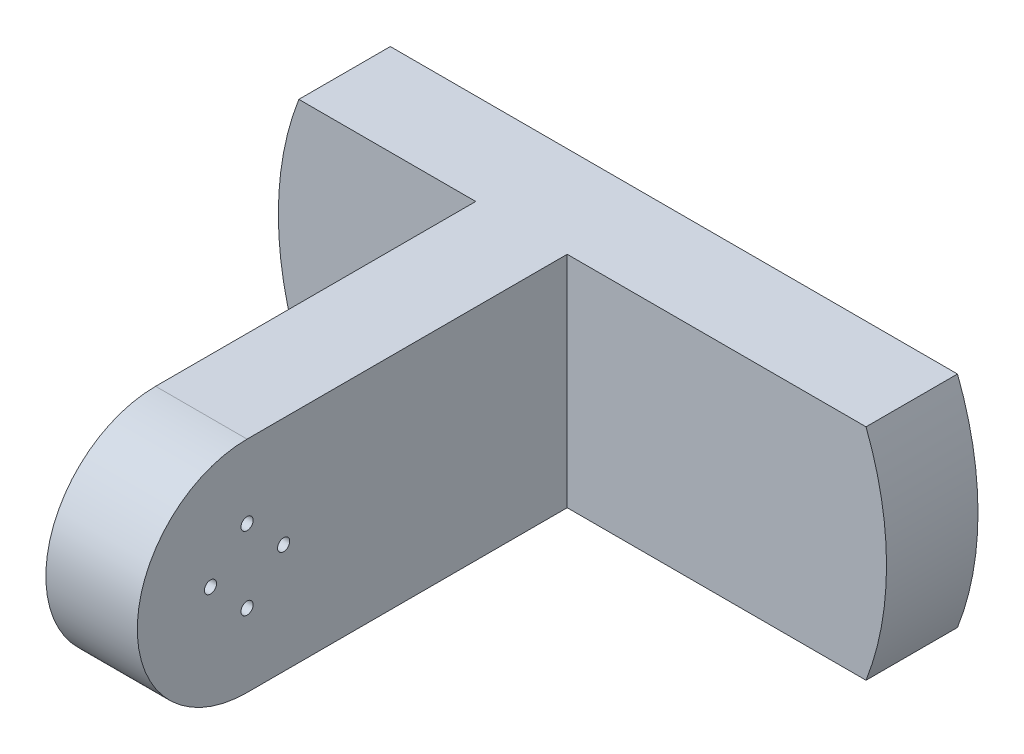
ISO-10303-21;
HEADER;
FILE_DESCRIPTION(('STEP AP214'),'2;1');
FILE_NAME('part.step','',(''),(''),'','','');
FILE_SCHEMA(('AUTOMOTIVE_DESIGN { 1 0 10303 214 1 1 1 1 }'));
ENDSEC;
DATA;
#1=APPLICATION_CONTEXT('core data for automotive mechanical design processes');
#2=APPLICATION_PROTOCOL_DEFINITION('international standard','automotive_design',2000,#1);
#3=PRODUCT_CONTEXT('',#1,'mechanical');
#4=PRODUCT('Part','Part','',(#3));
#5=PRODUCT_RELATED_PRODUCT_CATEGORY('part','',(#4));
#6=PRODUCT_DEFINITION_FORMATION('','',#4);
#7=PRODUCT_DEFINITION_CONTEXT('part definition',#1,'design');
#8=PRODUCT_DEFINITION('design','',#6,#7);
#9=PRODUCT_DEFINITION_SHAPE('','',#8);
#10=(LENGTH_UNIT() NAMED_UNIT(*) SI_UNIT(.MILLI.,.METRE.));
#11=(NAMED_UNIT(*) PLANE_ANGLE_UNIT() SI_UNIT($,.RADIAN.));
#12=(NAMED_UNIT(*) SI_UNIT($,.STERADIAN.) SOLID_ANGLE_UNIT());
#13=UNCERTAINTY_MEASURE_WITH_UNIT(LENGTH_MEASURE(1.E-05),#10,'distance_accuracy_value','');
#14=(GEOMETRIC_REPRESENTATION_CONTEXT(3) GLOBAL_UNCERTAINTY_ASSIGNED_CONTEXT((#13)) GLOBAL_UNIT_ASSIGNED_CONTEXT((#10,
#11,#12)) REPRESENTATION_CONTEXT('',''));
#15=CARTESIAN_POINT('',(0.,0.,0.));
#16=DIRECTION('',(0.,0.,1.));
#17=DIRECTION('',(1.,0.,0.));
#18=AXIS2_PLACEMENT_3D('',#15,#16,#17);
#19=CARTESIAN_POINT('',(0.,0.,15.));
#20=DIRECTION('',(0.,0.,1.));
#21=DIRECTION('',(1.,0.,0.));
#22=AXIS2_PLACEMENT_3D('',#19,#20,#21);
#23=PLANE('',#22);
#24=DIRECTION('',(1.,0.,0.));
#25=VECTOR('',#24,1.);
#26=CARTESIAN_POINT('',(0.,14.7564960958572,15.));
#27=LINE('',#26,#25);
#28=CARTESIAN_POINT('',(-0.258259020775649,14.7564960958572,15.));
#29=VERTEX_POINT('',#28);
#30=CARTESIAN_POINT('',(48.7499864847259,14.7564960958572,15.));
#31=VERTEX_POINT('',#30);
#32=EDGE_CURVE('E62',#29,#31,#27,.T.);
#33=ORIENTED_EDGE('',*,*,#32,.F.);
#34=DIRECTION('',(0.,-1.,0.));
#35=VECTOR('',#34,1.);
#36=CARTESIAN_POINT('',(-0.258259020775649,0.,15.));
#37=LINE('',#36,#35);
#38=CARTESIAN_POINT('',(-0.258259020775649,-21.2435039041428,15.));
#39=VERTEX_POINT('',#38);
#40=EDGE_CURVE('E79',#29,#39,#37,.T.);
#41=ORIENTED_EDGE('',*,*,#40,.T.);
#42=DIRECTION('',(1.,0.,0.));
#43=VECTOR('',#42,1.);
#44=CARTESIAN_POINT('',(0.,-21.2435039041428,15.));
#45=LINE('',#44,#43);
#46=CARTESIAN_POINT('',(48.7499864847258,-21.2435039041428,15.));
#47=VERTEX_POINT('',#46);
#48=EDGE_CURVE('E298',#39,#47,#45,.T.);
#49=ORIENTED_EDGE('',*,*,#48,.T.);
#50=CARTESIAN_POINT('',(2.24174097922436,-3.24350390414277,15.));
#51=DIRECTION('',(0.,0.,1.));
#52=DIRECTION('',(1.,0.,0.));
#53=AXIS2_PLACEMENT_3D('',#50,#51,#52);
#54=CIRCLE('',#53,49.87);
#55=EDGE_CURVE('E246',#31,#47,#54,.F.);
#56=ORIENTED_EDGE('',*,*,#55,.F.);
#57=EDGE_LOOP('',(#33,#41,#49,#56));
#58=FACE_BOUND('',#57,.T.);
#59=ADVANCED_FACE('F52',(#58),#23,.T.);
#60=CARTESIAN_POINT('',(0.,-21.2435039041428,15.));
#61=DIRECTION('',(0.,1.,0.));
#62=DIRECTION('',(-1.,0.,0.));
#63=AXIS2_PLACEMENT_3D('',#60,#61,#62);
#64=PLANE('',#63);
#65=DIRECTION('',(0.,0.,-1.));
#66=VECTOR('',#65,1.);
#67=CARTESIAN_POINT('',(-44.2665045262771,-21.2435039041428,15.001));
#68=LINE('',#67,#66);
#69=CARTESIAN_POINT('',(-44.2665045262771,-21.2435039041428,15.));
#70=VERTEX_POINT('',#69);
#71=CARTESIAN_POINT('',(-44.2665045262771,-21.2435039041428,0.));
#72=VERTEX_POINT('',#71);
#73=EDGE_CURVE('E236',#70,#72,#68,.T.);
#74=ORIENTED_EDGE('',*,*,#73,.T.);
#75=DIRECTION('',(1.,0.,0.));
#76=VECTOR('',#75,1.);
#77=CARTESIAN_POINT('',(0.,-21.2435039041428,0.));
#78=LINE('',#77,#76);
#79=CARTESIAN_POINT('',(48.7499864847258,-21.2435039041428,0.));
#80=VERTEX_POINT('',#79);
#81=EDGE_CURVE('E264',#72,#80,#78,.T.);
#82=ORIENTED_EDGE('',*,*,#81,.T.);
#83=DIRECTION('',(0.,0.,-1.));
#84=VECTOR('',#83,1.);
#85=CARTESIAN_POINT('',(48.7499864847258,-21.2435039041428,15.001));
#86=LINE('',#85,#84);
#87=EDGE_CURVE('E251',#47,#80,#86,.T.);
#88=ORIENTED_EDGE('',*,*,#87,.F.);
#89=ORIENTED_EDGE('',*,*,#48,.F.);
#90=DIRECTION('',(0.,0.,1.));
#91=VECTOR('',#90,1.);
#92=CARTESIAN_POINT('',(-0.258259020775649,-21.2435039041428,0.));
#93=LINE('',#92,#91);
#94=CARTESIAN_POINT('',(-0.258259020775649,-21.2435039041428,67.5));
#95=VERTEX_POINT('',#94);
#96=EDGE_CURVE('E219',#39,#95,#93,.T.);
#97=ORIENTED_EDGE('',*,*,#96,.T.);
#98=DIRECTION('',(1.,0.,0.));
#99=VECTOR('',#98,1.);
#100=CARTESIAN_POINT('',(-15.2582590207756,-21.2435039041428,67.5));
#101=LINE('',#100,#99);
#102=CARTESIAN_POINT('',(-15.2582590207756,-21.2435039041428,67.5));
#103=VERTEX_POINT('',#102);
#104=EDGE_CURVE('E237',#103,#95,#101,.T.);
#105=ORIENTED_EDGE('',*,*,#104,.F.);
#106=DIRECTION('',(0.,0.,1.));
#107=VECTOR('',#106,1.);
#108=CARTESIAN_POINT('',(-15.2582590207756,-21.2435039041428,0.));
#109=LINE('',#108,#107);
#110=CARTESIAN_POINT('',(-15.2582590207756,-21.2435039041428,15.));
#111=VERTEX_POINT('',#110);
#112=EDGE_CURVE('E230',#111,#103,#109,.T.);
#113=ORIENTED_EDGE('',*,*,#112,.F.);
#114=EDGE_CURVE('E299',#70,#111,#45,.T.);
#115=ORIENTED_EDGE('',*,*,#114,.F.);
#116=EDGE_LOOP('',(#74,#82,#88,#89,#97,#105,#113,#115));
#117=FACE_BOUND('',#116,.T.);
#118=ADVANCED_FACE('F54',(#117),#64,.F.);
#119=CARTESIAN_POINT('',(0.,14.7564960958572,15.));
#120=DIRECTION('',(0.,1.,0.));
#121=DIRECTION('',(-1.,0.,0.));
#122=AXIS2_PLACEMENT_3D('',#119,#120,#121);
#123=PLANE('',#122);
#124=CARTESIAN_POINT('',(-44.2665045262771,14.7564960958572,15.));
#125=VERTEX_POINT('',#124);
#126=CARTESIAN_POINT('',(-15.2582590207756,14.7564960958572,15.));
#127=VERTEX_POINT('',#126);
#128=EDGE_CURVE('E11',#125,#127,#27,.T.);
#129=ORIENTED_EDGE('',*,*,#128,.T.);
#130=DIRECTION('',(0.,0.,1.));
#131=VECTOR('',#130,1.);
#132=CARTESIAN_POINT('',(-15.2582590207756,14.7564960958572,0.));
#133=LINE('',#132,#131);
#134=CARTESIAN_POINT('',(-15.2582590207756,14.7564960958572,67.5));
#135=VERTEX_POINT('',#134);
#136=EDGE_CURVE('E221',#127,#135,#133,.T.);
#137=ORIENTED_EDGE('',*,*,#136,.T.);
#138=DIRECTION('',(1.,0.,0.));
#139=VECTOR('',#138,1.);
#140=CARTESIAN_POINT('',(-15.2582590207756,14.7564960958572,67.5));
#141=LINE('',#140,#139);
#142=CARTESIAN_POINT('',(-0.258259020775649,14.7564960958572,67.5));
#143=VERTEX_POINT('',#142);
#144=EDGE_CURVE('E234',#135,#143,#141,.T.);
#145=ORIENTED_EDGE('',*,*,#144,.T.);
#146=DIRECTION('',(0.,0.,1.));
#147=VECTOR('',#146,1.);
#148=CARTESIAN_POINT('',(-0.258259020775649,14.7564960958572,0.));
#149=LINE('',#148,#147);
#150=EDGE_CURVE('E210',#29,#143,#149,.T.);
#151=ORIENTED_EDGE('',*,*,#150,.F.);
#152=ORIENTED_EDGE('',*,*,#32,.T.);
#153=DIRECTION('',(0.,0.,-1.));
#154=VECTOR('',#153,1.);
#155=CARTESIAN_POINT('',(48.7499864847259,14.7564960958572,15.001));
#156=LINE('',#155,#154);
#157=CARTESIAN_POINT('',(48.7499864847259,14.7564960958572,0.));
#158=VERTEX_POINT('',#157);
#159=EDGE_CURVE('E238',#31,#158,#156,.T.);
#160=ORIENTED_EDGE('',*,*,#159,.T.);
#161=DIRECTION('',(1.,0.,0.));
#162=VECTOR('',#161,1.);
#163=CARTESIAN_POINT('',(0.,14.7564960958572,0.));
#164=LINE('',#163,#162);
#165=CARTESIAN_POINT('',(-44.2665045262771,14.7564960958572,0.));
#166=VERTEX_POINT('',#165);
#167=EDGE_CURVE('E60',#166,#158,#164,.T.);
#168=ORIENTED_EDGE('',*,*,#167,.F.);
#169=DIRECTION('',(0.,0.,-1.));
#170=VECTOR('',#169,1.);
#171=CARTESIAN_POINT('',(-44.2665045262771,14.7564960958572,15.001));
#172=LINE('',#171,#170);
#173=EDGE_CURVE('E249',#125,#166,#172,.T.);
#174=ORIENTED_EDGE('',*,*,#173,.F.);
#175=EDGE_LOOP('',(#129,#137,#145,#151,#152,#160,#168,#174));
#176=FACE_BOUND('',#175,.T.);
#177=ADVANCED_FACE('F314',(#176),#123,.T.);
#178=DIRECTION('',(0.,-1.,0.));
#179=VECTOR('',#178,1.);
#180=CARTESIAN_POINT('',(-15.2582590207756,0.,15.));
#181=LINE('',#180,#179);
#182=EDGE_CURVE('E235',#127,#111,#181,.T.);
#183=ORIENTED_EDGE('',*,*,#182,.F.);
#184=ORIENTED_EDGE('',*,*,#128,.F.);
#185=CARTESIAN_POINT('',(2.24174097922436,-3.24350390414277,15.));
#186=DIRECTION('',(0.,0.,1.));
#187=DIRECTION('',(1.,0.,0.));
#188=AXIS2_PLACEMENT_3D('',#185,#186,#187);
#189=CIRCLE('',#188,49.87);
#190=EDGE_CURVE('E244',#70,#125,#189,.F.);
#191=ORIENTED_EDGE('',*,*,#190,.F.);
#192=ORIENTED_EDGE('',*,*,#114,.T.);
#193=EDGE_LOOP('',(#183,#184,#191,#192));
#194=FACE_BOUND('',#193,.T.);
#195=ADVANCED_FACE('F317',(#194),#23,.T.);
#196=CARTESIAN_POINT('',(0.,0.,0.));
#197=DIRECTION('',(0.,0.,1.));
#198=DIRECTION('',(1.,0.,0.));
#199=AXIS2_PLACEMENT_3D('',#196,#197,#198);
#200=PLANE('',#199);
#201=CARTESIAN_POINT('',(-40.6282590207756,-3.24350390414277,0.));
#202=DIRECTION('',(0.,0.,1.));
#203=DIRECTION('',(1.,0.,0.));
#204=AXIS2_PLACEMENT_3D('',#201,#202,#203);
#205=CIRCLE('',#204,0.999999999999983);
#206=CARTESIAN_POINT('',(-39.6282590207757,-3.24350390414277,0.));
#207=VERTEX_POINT('',#206);
#208=EDGE_CURVE('E266',#207,#207,#205,.T.);
#209=ORIENTED_EDGE('',*,*,#208,.T.);
#210=EDGE_LOOP('',(#209));
#211=FACE_BOUND('',#210,.T.);
#212=CARTESIAN_POINT('',(-38.6096592415759,9.75649609585722,0.));
#213=DIRECTION('',(0.,0.,1.));
#214=DIRECTION('',(1.,0.,0.));
#215=AXIS2_PLACEMENT_3D('',#212,#213,#214);
#216=CIRCLE('',#215,0.999999999999998);
#217=CARTESIAN_POINT('',(-37.6096592415759,9.75649609585722,0.));
#218=VERTEX_POINT('',#217);
#219=EDGE_CURVE('E258',#218,#218,#216,.T.);
#220=ORIENTED_EDGE('',*,*,#219,.T.);
#221=EDGE_LOOP('',(#220));
#222=FACE_BOUND('',#221,.T.);
#223=CARTESIAN_POINT('',(43.0931412000246,9.75649609585722,0.));
#224=DIRECTION('',(0.,0.,1.));
#225=DIRECTION('',(1.,0.,0.));
#226=AXIS2_PLACEMENT_3D('',#223,#224,#225);
#227=CIRCLE('',#226,0.999999999999998);
#228=CARTESIAN_POINT('',(44.0931412000246,9.75649609585722,0.));
#229=VERTEX_POINT('',#228);
#230=EDGE_CURVE('E272',#229,#229,#227,.T.);
#231=ORIENTED_EDGE('',*,*,#230,.T.);
#232=EDGE_LOOP('',(#231));
#233=FACE_BOUND('',#232,.T.);
#234=CARTESIAN_POINT('',(45.1117409792244,-3.24350390414277,0.));
#235=DIRECTION('',(0.,0.,1.));
#236=DIRECTION('',(1.,0.,0.));
#237=AXIS2_PLACEMENT_3D('',#234,#235,#236);
#238=CIRCLE('',#237,0.999999999999998);
#239=CARTESIAN_POINT('',(46.1117409792244,-3.24350390414277,0.));
#240=VERTEX_POINT('',#239);
#241=EDGE_CURVE('E289',#240,#240,#238,.T.);
#242=ORIENTED_EDGE('',*,*,#241,.T.);
#243=EDGE_LOOP('',(#242));
#244=FACE_BOUND('',#243,.T.);
#245=CARTESIAN_POINT('',(43.0931412000246,-16.2435039041428,0.));
#246=DIRECTION('',(0.,0.,1.));
#247=DIRECTION('',(1.,0.,0.));
#248=AXIS2_PLACEMENT_3D('',#245,#246,#247);
#249=CIRCLE('',#248,0.999999999999998);
#250=CARTESIAN_POINT('',(44.0931412000246,-16.2435039041428,0.));
#251=VERTEX_POINT('',#250);
#252=EDGE_CURVE('E283',#251,#251,#249,.T.);
#253=ORIENTED_EDGE('',*,*,#252,.T.);
#254=EDGE_LOOP('',(#253));
#255=FACE_BOUND('',#254,.T.);
#256=CARTESIAN_POINT('',(-38.6096592415759,-16.2435039041428,0.));
#257=DIRECTION('',(0.,0.,1.));
#258=DIRECTION('',(1.,0.,0.));
#259=AXIS2_PLACEMENT_3D('',#256,#257,#258);
#260=CIRCLE('',#259,0.999999999999998);
#261=CARTESIAN_POINT('',(-37.6096592415759,-16.2435039041428,0.));
#262=VERTEX_POINT('',#261);
#263=EDGE_CURVE('E279',#262,#262,#260,.T.);
#264=ORIENTED_EDGE('',*,*,#263,.T.);
#265=EDGE_LOOP('',(#264));
#266=FACE_BOUND('',#265,.T.);
#267=ORIENTED_EDGE('',*,*,#167,.T.);
#268=CARTESIAN_POINT('',(2.24174097922436,-3.24350390414277,0.));
#269=DIRECTION('',(0.,0.,-1.));
#270=DIRECTION('',(-1.,0.,0.));
#271=AXIS2_PLACEMENT_3D('',#268,#269,#270);
#272=CIRCLE('',#271,49.87);
#273=EDGE_CURVE('E248',#158,#80,#272,.T.);
#274=ORIENTED_EDGE('',*,*,#273,.T.);
#275=ORIENTED_EDGE('',*,*,#81,.F.);
#276=CARTESIAN_POINT('',(2.24174097922436,-3.24350390414277,0.));
#277=DIRECTION('',(0.,0.,-1.));
#278=DIRECTION('',(-1.,0.,0.));
#279=AXIS2_PLACEMENT_3D('',#276,#277,#278);
#280=CIRCLE('',#279,49.87);
#281=EDGE_CURVE('E256',#72,#166,#280,.T.);
#282=ORIENTED_EDGE('',*,*,#281,.T.);
#283=EDGE_LOOP('',(#267,#274,#275,#282));
#284=FACE_BOUND('',#283,.T.);
#285=ADVANCED_FACE('F327',(#211,#222,#233,#244,#255,#266,#284),#200,.F.);
#286=CARTESIAN_POINT('',(-38.6096592415759,-16.2435039041428,5.));
#287=DIRECTION('',(0.,0.,-1.));
#288=DIRECTION('',(-1.,0.,0.));
#289=AXIS2_PLACEMENT_3D('',#286,#287,#288);
#290=CYLINDRICAL_SURFACE('',#289,0.999999999999998);
#291=CARTESIAN_POINT('',(-38.6096592415759,-16.2435039041428,5.));
#292=DIRECTION('',(0.,0.,1.));
#293=DIRECTION('',(1.,0.,0.));
#294=AXIS2_PLACEMENT_3D('',#291,#292,#293);
#295=CIRCLE('',#294,0.999999999999998);
#296=CARTESIAN_POINT('',(-37.6096592415759,-16.2435039041428,5.));
#297=VERTEX_POINT('',#296);
#298=EDGE_CURVE('E267',#297,#297,#295,.T.);
#299=ORIENTED_EDGE('',*,*,#298,.T.);
#300=EDGE_LOOP('',(#299));
#301=FACE_BOUND('',#300,.T.);
#302=ORIENTED_EDGE('',*,*,#263,.F.);
#303=EDGE_LOOP('',(#302));
#304=FACE_BOUND('',#303,.T.);
#305=ADVANCED_FACE('F331',(#301,#304),#290,.F.);
#306=CARTESIAN_POINT('',(0.,0.,5.));
#307=DIRECTION('',(0.,0.,1.));
#308=DIRECTION('',(1.,0.,0.));
#309=AXIS2_PLACEMENT_3D('',#306,#307,#308);
#310=PLANE('',#309);
#311=ORIENTED_EDGE('',*,*,#298,.F.);
#312=EDGE_LOOP('',(#311));
#313=FACE_BOUND('',#312,.T.);
#314=ADVANCED_FACE('F388',(#313),#310,.F.);
#315=CARTESIAN_POINT('',(43.0931412000246,-16.2435039041428,5.));
#316=DIRECTION('',(0.,0.,-1.));
#317=DIRECTION('',(-1.,0.,0.));
#318=AXIS2_PLACEMENT_3D('',#315,#316,#317);
#319=CYLINDRICAL_SURFACE('',#318,0.999999999999998);
#320=CARTESIAN_POINT('',(43.0931412000246,-16.2435039041428,5.));
#321=DIRECTION('',(0.,0.,1.));
#322=DIRECTION('',(1.,0.,0.));
#323=AXIS2_PLACEMENT_3D('',#320,#321,#322);
#324=CIRCLE('',#323,0.999999999999998);
#325=CARTESIAN_POINT('',(44.0931412000246,-16.2435039041428,5.));
#326=VERTEX_POINT('',#325);
#327=EDGE_CURVE('E281',#326,#326,#324,.T.);
#328=ORIENTED_EDGE('',*,*,#327,.T.);
#329=EDGE_LOOP('',(#328));
#330=FACE_BOUND('',#329,.T.);
#331=ORIENTED_EDGE('',*,*,#252,.F.);
#332=EDGE_LOOP('',(#331));
#333=FACE_BOUND('',#332,.T.);
#334=ADVANCED_FACE('F394',(#330,#333),#319,.F.);
#335=CARTESIAN_POINT('',(0.,0.,5.));
#336=DIRECTION('',(0.,0.,1.));
#337=DIRECTION('',(1.,0.,0.));
#338=AXIS2_PLACEMENT_3D('',#335,#336,#337);
#339=PLANE('',#338);
#340=ORIENTED_EDGE('',*,*,#327,.F.);
#341=EDGE_LOOP('',(#340));
#342=FACE_BOUND('',#341,.T.);
#343=ADVANCED_FACE('F397',(#342),#339,.F.);
#344=CARTESIAN_POINT('',(45.1117409792244,-3.24350390414277,5.));
#345=DIRECTION('',(0.,0.,-1.));
#346=DIRECTION('',(-1.,0.,0.));
#347=AXIS2_PLACEMENT_3D('',#344,#345,#346);
#348=CYLINDRICAL_SURFACE('',#347,0.999999999999998);
#349=CARTESIAN_POINT('',(45.1117409792244,-3.24350390414277,5.));
#350=DIRECTION('',(0.,0.,1.));
#351=DIRECTION('',(1.,0.,0.));
#352=AXIS2_PLACEMENT_3D('',#349,#350,#351);
#353=CIRCLE('',#352,0.999999999999998);
#354=CARTESIAN_POINT('',(46.1117409792244,-3.24350390414277,5.));
#355=VERTEX_POINT('',#354);
#356=EDGE_CURVE('E290',#355,#355,#353,.T.);
#357=ORIENTED_EDGE('',*,*,#356,.T.);
#358=EDGE_LOOP('',(#357));
#359=FACE_BOUND('',#358,.T.);
#360=ORIENTED_EDGE('',*,*,#241,.F.);
#361=EDGE_LOOP('',(#360));
#362=FACE_BOUND('',#361,.T.);
#363=ADVANCED_FACE('F402',(#359,#362),#348,.F.);
#364=CARTESIAN_POINT('',(0.,0.,5.));
#365=DIRECTION('',(0.,0.,1.));
#366=DIRECTION('',(1.,0.,0.));
#367=AXIS2_PLACEMENT_3D('',#364,#365,#366);
#368=PLANE('',#367);
#369=ORIENTED_EDGE('',*,*,#356,.F.);
#370=EDGE_LOOP('',(#369));
#371=FACE_BOUND('',#370,.T.);
#372=ADVANCED_FACE('F406',(#371),#368,.F.);
#373=CARTESIAN_POINT('',(43.0931412000246,9.75649609585722,5.));
#374=DIRECTION('',(0.,0.,-1.));
#375=DIRECTION('',(-1.,0.,0.));
#376=AXIS2_PLACEMENT_3D('',#373,#374,#375);
#377=CYLINDRICAL_SURFACE('',#376,0.999999999999998);
#378=CARTESIAN_POINT('',(43.0931412000246,9.75649609585722,5.));
#379=DIRECTION('',(0.,0.,1.));
#380=DIRECTION('',(1.,0.,0.));
#381=AXIS2_PLACEMENT_3D('',#378,#379,#380);
#382=CIRCLE('',#381,0.999999999999998);
#383=CARTESIAN_POINT('',(44.0931412000246,9.75649609585722,5.));
#384=VERTEX_POINT('',#383);
#385=EDGE_CURVE('E291',#384,#384,#382,.T.);
#386=ORIENTED_EDGE('',*,*,#385,.T.);
#387=EDGE_LOOP('',(#386));
#388=FACE_BOUND('',#387,.T.);
#389=ORIENTED_EDGE('',*,*,#230,.F.);
#390=EDGE_LOOP('',(#389));
#391=FACE_BOUND('',#390,.T.);
#392=ADVANCED_FACE('F408',(#388,#391),#377,.F.);
#393=CARTESIAN_POINT('',(0.,0.,5.));
#394=DIRECTION('',(0.,0.,1.));
#395=DIRECTION('',(1.,0.,0.));
#396=AXIS2_PLACEMENT_3D('',#393,#394,#395);
#397=PLANE('',#396);
#398=ORIENTED_EDGE('',*,*,#385,.F.);
#399=EDGE_LOOP('',(#398));
#400=FACE_BOUND('',#399,.T.);
#401=ADVANCED_FACE('F389',(#400),#397,.F.);
#402=CARTESIAN_POINT('',(-38.6096592415759,9.75649609585722,5.));
#403=DIRECTION('',(0.,0.,-1.));
#404=DIRECTION('',(-1.,0.,0.));
#405=AXIS2_PLACEMENT_3D('',#402,#403,#404);
#406=CYLINDRICAL_SURFACE('',#405,0.999999999999998);
#407=CARTESIAN_POINT('',(-38.6096592415759,9.75649609585722,5.));
#408=DIRECTION('',(0.,0.,1.));
#409=DIRECTION('',(1.,0.,0.));
#410=AXIS2_PLACEMENT_3D('',#407,#408,#409);
#411=CIRCLE('',#410,0.999999999999998);
#412=CARTESIAN_POINT('',(-37.6096592415759,9.75649609585722,5.));
#413=VERTEX_POINT('',#412);
#414=EDGE_CURVE('E269',#413,#413,#411,.T.);
#415=ORIENTED_EDGE('',*,*,#414,.T.);
#416=EDGE_LOOP('',(#415));
#417=FACE_BOUND('',#416,.T.);
#418=ORIENTED_EDGE('',*,*,#219,.F.);
#419=EDGE_LOOP('',(#418));
#420=FACE_BOUND('',#419,.T.);
#421=ADVANCED_FACE('F383',(#417,#420),#406,.F.);
#422=CARTESIAN_POINT('',(0.,0.,5.));
#423=DIRECTION('',(0.,0.,1.));
#424=DIRECTION('',(1.,0.,0.));
#425=AXIS2_PLACEMENT_3D('',#422,#423,#424);
#426=PLANE('',#425);
#427=ORIENTED_EDGE('',*,*,#414,.F.);
#428=EDGE_LOOP('',(#427));
#429=FACE_BOUND('',#428,.T.);
#430=ADVANCED_FACE('F379',(#429),#426,.F.);
#431=CARTESIAN_POINT('',(-40.6282590207756,-3.24350390414277,5.));
#432=DIRECTION('',(0.,0.,-1.));
#433=DIRECTION('',(-1.,0.,0.));
#434=AXIS2_PLACEMENT_3D('',#431,#432,#433);
#435=CYLINDRICAL_SURFACE('',#434,0.999999999999983);
#436=CARTESIAN_POINT('',(-40.6282590207756,-3.24350390414277,5.));
#437=DIRECTION('',(0.,0.,1.));
#438=DIRECTION('',(1.,0.,0.));
#439=AXIS2_PLACEMENT_3D('',#436,#437,#438);
#440=CIRCLE('',#439,0.999999999999983);
#441=CARTESIAN_POINT('',(-39.6282590207757,-3.24350390414277,5.));
#442=VERTEX_POINT('',#441);
#443=EDGE_CURVE('E265',#442,#442,#440,.T.);
#444=ORIENTED_EDGE('',*,*,#443,.T.);
#445=EDGE_LOOP('',(#444));
#446=FACE_BOUND('',#445,.T.);
#447=ORIENTED_EDGE('',*,*,#208,.F.);
#448=EDGE_LOOP('',(#447));
#449=FACE_BOUND('',#448,.T.);
#450=ADVANCED_FACE('F376',(#446,#449),#435,.F.);
#451=CARTESIAN_POINT('',(0.,0.,5.));
#452=DIRECTION('',(0.,0.,1.));
#453=DIRECTION('',(1.,0.,0.));
#454=AXIS2_PLACEMENT_3D('',#451,#452,#453);
#455=PLANE('',#454);
#456=ORIENTED_EDGE('',*,*,#443,.F.);
#457=EDGE_LOOP('',(#456));
#458=FACE_BOUND('',#457,.T.);
#459=ADVANCED_FACE('F375',(#458),#455,.F.);
#460=CARTESIAN_POINT('',(2.24174097922436,-3.24350390414277,15.001));
#461=DIRECTION('',(0.,0.,-1.));
#462=DIRECTION('',(-1.,0.,0.));
#463=AXIS2_PLACEMENT_3D('',#460,#461,#462);
#464=CYLINDRICAL_SURFACE('',#463,49.87);
#465=ORIENTED_EDGE('',*,*,#190,.T.);
#466=ORIENTED_EDGE('',*,*,#173,.T.);
#467=ORIENTED_EDGE('',*,*,#281,.F.);
#468=ORIENTED_EDGE('',*,*,#73,.F.);
#469=EDGE_LOOP('',(#465,#466,#467,#468));
#470=FACE_BOUND('',#469,.T.);
#471=ADVANCED_FACE('F369',(#470),#464,.T.);
#472=CARTESIAN_POINT('',(2.24174097922436,-3.24350390414277,15.001));
#473=DIRECTION('',(0.,0.,-1.));
#474=DIRECTION('',(-1.,0.,0.));
#475=AXIS2_PLACEMENT_3D('',#472,#473,#474);
#476=CYLINDRICAL_SURFACE('',#475,49.87);
#477=ORIENTED_EDGE('',*,*,#55,.T.);
#478=ORIENTED_EDGE('',*,*,#87,.T.);
#479=ORIENTED_EDGE('',*,*,#273,.F.);
#480=ORIENTED_EDGE('',*,*,#159,.F.);
#481=EDGE_LOOP('',(#477,#478,#479,#480));
#482=FACE_BOUND('',#481,.T.);
#483=ADVANCED_FACE('F309',(#482),#476,.T.);
#484=CARTESIAN_POINT('',(-15.2582590207756,-3.24350390414277,67.5));
#485=DIRECTION('',(1.,0.,0.));
#486=DIRECTION('',(0.,0.,-1.));
#487=AXIS2_PLACEMENT_3D('',#484,#485,#486);
#488=CYLINDRICAL_SURFACE('',#487,18.);
#489=ORIENTED_EDGE('',*,*,#104,.T.);
#490=CARTESIAN_POINT('',(-0.258259020775649,-3.24350390414277,67.5));
#491=DIRECTION('',(1.,0.,0.));
#492=DIRECTION('',(0.,0.,-1.));
#493=AXIS2_PLACEMENT_3D('',#490,#491,#492);
#494=CIRCLE('',#493,18.);
#495=EDGE_CURVE('E220',#143,#95,#494,.T.);
#496=ORIENTED_EDGE('',*,*,#495,.F.);
#497=ORIENTED_EDGE('',*,*,#144,.F.);
#498=CARTESIAN_POINT('',(-15.2582590207756,-3.24350390414277,67.5));
#499=DIRECTION('',(1.,0.,0.));
#500=DIRECTION('',(0.,0.,-1.));
#501=AXIS2_PLACEMENT_3D('',#498,#499,#500);
#502=CIRCLE('',#501,18.);
#503=EDGE_CURVE('E227',#135,#103,#502,.T.);
#504=ORIENTED_EDGE('',*,*,#503,.T.);
#505=EDGE_LOOP('',(#489,#496,#497,#504));
#506=FACE_BOUND('',#505,.T.);
#507=ADVANCED_FACE('F344',(#506),#488,.T.);
#508=CARTESIAN_POINT('',(-15.2582590207756,0.,0.));
#509=DIRECTION('',(1.,0.,0.));
#510=DIRECTION('',(0.,0.,-1.));
#511=AXIS2_PLACEMENT_3D('',#508,#509,#510);
#512=PLANE('',#511);
#513=DIRECTION('',(0.,0.499999999999995,-0.866025403784441));
#514=VECTOR('',#513,1.);
#515=CARTESIAN_POINT('',(-15.2582590207756,34.2957294496176,19.800648629791));
#516=LINE('',#515,#514);
#517=CARTESIAN_POINT('',(-15.2582590207756,1.7564960958573,76.1602540378443));
#518=VERTEX_POINT('',#517);
#519=CARTESIAN_POINT('',(-15.2582590207756,6.75649609585722,67.5));
#520=VERTEX_POINT('',#519);
#521=EDGE_CURVE('E193',#518,#520,#516,.T.);
#522=ORIENTED_EDGE('',*,*,#521,.F.);
#523=DIRECTION('',(0.,1.,0.));
#524=VECTOR('',#523,1.);
#525=CARTESIAN_POINT('',(-15.2582590207756,8.45548675941157E-13,76.1602540378443));
#526=LINE('',#525,#524);
#527=CARTESIAN_POINT('',(-15.2582590207756,-8.24350390414269,76.1602540378444));
#528=VERTEX_POINT('',#527);
#529=EDGE_CURVE('E69',#528,#518,#526,.T.);
#530=ORIENTED_EDGE('',*,*,#529,.F.);
#531=DIRECTION('',(0.,0.500000000000007,0.866025403784435));
#532=VECTOR('',#531,1.);
#533=CARTESIAN_POINT('',(-15.2582590207756,-39.1609853058321,22.6096054080536));
#534=LINE('',#533,#532);
#535=CARTESIAN_POINT('',(-15.2582590207756,-13.2435039041428,67.5000000000001));
#536=VERTEX_POINT('',#535);
#537=EDGE_CURVE('E180',#536,#528,#534,.T.);
#538=ORIENTED_EDGE('',*,*,#537,.F.);
#539=DIRECTION('',(0.,-0.499999999999995,0.866025403784442));
#540=VECTOR('',#539,1.);
#541=CARTESIAN_POINT('',(-15.2582590207756,19.2957294496175,11.1403945919467));
#542=LINE('',#541,#540);
#543=CARTESIAN_POINT('',(-15.2582590207756,-8.24350390414281,58.8397459621556));
#544=VERTEX_POINT('',#543);
#545=EDGE_CURVE('E179',#544,#536,#542,.T.);
#546=ORIENTED_EDGE('',*,*,#545,.F.);
#547=DIRECTION('',(0.,-1.,0.));
#548=VECTOR('',#547,1.);
#549=CARTESIAN_POINT('',(-15.2582590207756,2.04141377282126E-13,58.8397459621556));
#550=LINE('',#549,#548);
#551=CARTESIAN_POINT('',(-15.2582590207756,1.7564960958572,58.8397459621556));
#552=VERTEX_POINT('',#551);
#553=EDGE_CURVE('E199',#552,#544,#550,.T.);
#554=ORIENTED_EDGE('',*,*,#553,.F.);
#555=DIRECTION('',(0.,-0.500000000000001,-0.866025403784438));
#556=VECTOR('',#555,1.);
#557=CARTESIAN_POINT('',(-15.2582590207756,-24.1609853058319,13.9493513702087));
#558=LINE('',#557,#556);
#559=EDGE_CURVE('E197',#520,#552,#558,.T.);
#560=ORIENTED_EDGE('',*,*,#559,.F.);
#561=EDGE_LOOP('',(#522,#530,#538,#546,#554,#560));
#562=FACE_BOUND('',#561,.T.);
#563=ORIENTED_EDGE('',*,*,#136,.F.);
#564=ORIENTED_EDGE('',*,*,#182,.T.);
#565=ORIENTED_EDGE('',*,*,#112,.T.);
#566=ORIENTED_EDGE('',*,*,#503,.F.);
#567=EDGE_LOOP('',(#563,#564,#565,#566));
#568=FACE_BOUND('',#567,.T.);
#569=ADVANCED_FACE('F345',(#562,#568),#512,.F.);
#570=CARTESIAN_POINT('',(-0.258259020775649,0.,0.));
#571=DIRECTION('',(1.,0.,0.));
#572=DIRECTION('',(0.,0.,-1.));
#573=AXIS2_PLACEMENT_3D('',#570,#571,#572);
#574=PLANE('',#573);
#575=CARTESIAN_POINT('',(-0.258259020775648,-3.24350390414277,61.5));
#576=DIRECTION('',(-1.,0.,0.));
#577=DIRECTION('',(0.,0.,1.));
#578=AXIS2_PLACEMENT_3D('',#575,#576,#577);
#579=CIRCLE('',#578,1.);
#580=CARTESIAN_POINT('',(-0.258259020775648,-3.24350390414277,62.5));
#581=VERTEX_POINT('',#580);
#582=EDGE_CURVE('E194',#581,#581,#579,.T.);
#583=ORIENTED_EDGE('',*,*,#582,.T.);
#584=EDGE_LOOP('',(#583));
#585=FACE_BOUND('',#584,.T.);
#586=CARTESIAN_POINT('',(-0.258259020775648,-3.24350390414277,73.5));
#587=DIRECTION('',(-1.,0.,0.));
#588=DIRECTION('',(0.,0.,1.));
#589=AXIS2_PLACEMENT_3D('',#586,#587,#588);
#590=CIRCLE('',#589,0.999999999999998);
#591=CARTESIAN_POINT('',(-0.258259020775648,-3.24350390414277,74.5));
#592=VERTEX_POINT('',#591);
#593=EDGE_CURVE('E630',#592,#592,#590,.T.);
#594=ORIENTED_EDGE('',*,*,#593,.T.);
#595=EDGE_LOOP('',(#594));
#596=FACE_BOUND('',#595,.T.);
#597=CARTESIAN_POINT('',(-0.258259020775648,2.75649609585723,67.5));
#598=DIRECTION('',(-1.,0.,0.));
#599=DIRECTION('',(0.,0.,1.));
#600=AXIS2_PLACEMENT_3D('',#597,#598,#599);
#601=CIRCLE('',#600,0.999999999999998);
#602=CARTESIAN_POINT('',(-0.258259020775648,2.75649609585723,68.5));
#603=VERTEX_POINT('',#602);
#604=EDGE_CURVE('E640',#603,#603,#601,.T.);
#605=ORIENTED_EDGE('',*,*,#604,.T.);
#606=EDGE_LOOP('',(#605));
#607=FACE_BOUND('',#606,.T.);
#608=CARTESIAN_POINT('',(-0.258259020775648,-9.24350390414278,67.5));
#609=DIRECTION('',(-1.,0.,0.));
#610=DIRECTION('',(0.,0.,1.));
#611=AXIS2_PLACEMENT_3D('',#608,#609,#610);
#612=CIRCLE('',#611,0.999999999999998);
#613=CARTESIAN_POINT('',(-0.258259020775648,-9.24350390414278,68.5));
#614=VERTEX_POINT('',#613);
#615=EDGE_CURVE('E644',#614,#614,#612,.T.);
#616=ORIENTED_EDGE('',*,*,#615,.T.);
#617=EDGE_LOOP('',(#616));
#618=FACE_BOUND('',#617,.T.);
#619=ORIENTED_EDGE('',*,*,#150,.T.);
#620=ORIENTED_EDGE('',*,*,#495,.T.);
#621=ORIENTED_EDGE('',*,*,#96,.F.);
#622=ORIENTED_EDGE('',*,*,#40,.F.);
#623=EDGE_LOOP('',(#619,#620,#621,#622));
#624=FACE_BOUND('',#623,.T.);
#625=ADVANCED_FACE('F349',(#585,#596,#607,#618,#624),#574,.T.);
#626=CARTESIAN_POINT('',(-5.25825902077565,8.45548675941157E-13,76.1602540378443));
#627=DIRECTION('',(0.,0.,1.));
#628=DIRECTION('',(0.,-1.,0.));
#629=AXIS2_PLACEMENT_3D('',#626,#627,#628);
#630=PLANE('',#629);
#631=ORIENTED_EDGE('',*,*,#529,.T.);
#632=DIRECTION('',(-1.,0.,0.));
#633=VECTOR('',#632,1.);
#634=CARTESIAN_POINT('',(-5.25825902077565,1.75649609585732,76.1602540378443));
#635=LINE('',#634,#633);
#636=CARTESIAN_POINT('',(-5.25825902077565,1.75649609585732,76.1602540378443));
#637=VERTEX_POINT('',#636);
#638=EDGE_CURVE('E152',#637,#518,#635,.T.);
#639=ORIENTED_EDGE('',*,*,#638,.F.);
#640=DIRECTION('',(0.,1.,0.));
#641=VECTOR('',#640,1.);
#642=CARTESIAN_POINT('',(-5.25825902077565,8.45548675941157E-13,76.1602540378443));
#643=LINE('',#642,#641);
#644=CARTESIAN_POINT('',(-5.25825902077565,-8.24350390414269,76.1602540378444));
#645=VERTEX_POINT('',#644);
#646=EDGE_CURVE('E158',#645,#637,#643,.T.);
#647=ORIENTED_EDGE('',*,*,#646,.F.);
#648=DIRECTION('',(-1.,0.,0.));
#649=VECTOR('',#648,1.);
#650=CARTESIAN_POINT('',(-5.25825902077565,-8.24350390414269,76.1602540378444));
#651=LINE('',#650,#649);
#652=EDGE_CURVE('E202',#645,#528,#651,.T.);
#653=ORIENTED_EDGE('',*,*,#652,.T.);
#654=EDGE_LOOP('',(#631,#639,#647,#653));
#655=FACE_BOUND('',#654,.T.);
#656=ADVANCED_FACE('F156',(#655),#630,.F.);
#657=CARTESIAN_POINT('',(-5.25825902077565,-39.1609853058321,22.6096054080536));
#658=DIRECTION('',(0.,-0.866025403784435,0.500000000000007));
#659=DIRECTION('',(0.,-0.500000000000007,-0.866025403784435));
#660=AXIS2_PLACEMENT_3D('',#657,#658,#659);
#661=PLANE('',#660);
#662=ORIENTED_EDGE('',*,*,#537,.T.);
#663=ORIENTED_EDGE('',*,*,#652,.F.);
#664=DIRECTION('',(0.,0.500000000000007,0.866025403784435));
#665=VECTOR('',#664,1.);
#666=CARTESIAN_POINT('',(-5.25825902077565,-39.1609853058321,22.6096054080536));
#667=LINE('',#666,#665);
#668=CARTESIAN_POINT('',(-5.25825902077565,-13.2435039041428,67.5000000000001));
#669=VERTEX_POINT('',#668);
#670=EDGE_CURVE('E163',#669,#645,#667,.T.);
#671=ORIENTED_EDGE('',*,*,#670,.F.);
#672=DIRECTION('',(-1.,0.,0.));
#673=VECTOR('',#672,1.);
#674=CARTESIAN_POINT('',(-5.25825902077565,-13.2435039041428,67.5000000000001));
#675=LINE('',#674,#673);
#676=EDGE_CURVE('E208',#669,#536,#675,.T.);
#677=ORIENTED_EDGE('',*,*,#676,.T.);
#678=EDGE_LOOP('',(#662,#663,#671,#677));
#679=FACE_BOUND('',#678,.T.);
#680=ADVANCED_FACE('F357',(#679),#661,.F.);
#681=CARTESIAN_POINT('',(-5.25825902077565,19.2957294496175,11.1403945919467));
#682=DIRECTION('',(0.,-0.866025403784442,-0.499999999999995));
#683=DIRECTION('',(0.,0.499999999999995,-0.866025403784442));
#684=AXIS2_PLACEMENT_3D('',#681,#682,#683);
#685=PLANE('',#684);
#686=ORIENTED_EDGE('',*,*,#545,.T.);
#687=ORIENTED_EDGE('',*,*,#676,.F.);
#688=DIRECTION('',(0.,-0.499999999999995,0.866025403784442));
#689=VECTOR('',#688,1.);
#690=CARTESIAN_POINT('',(-5.25825902077565,19.2957294496175,11.1403945919467));
#691=LINE('',#690,#689);
#692=CARTESIAN_POINT('',(-5.25825902077565,-8.24350390414281,58.8397459621556));
#693=VERTEX_POINT('',#692);
#694=EDGE_CURVE('E190',#693,#669,#691,.T.);
#695=ORIENTED_EDGE('',*,*,#694,.F.);
#696=DIRECTION('',(-1.,0.,0.));
#697=VECTOR('',#696,1.);
#698=CARTESIAN_POINT('',(-5.25825902077565,-8.24350390414281,58.8397459621556));
#699=LINE('',#698,#697);
#700=EDGE_CURVE('E209',#693,#544,#699,.T.);
#701=ORIENTED_EDGE('',*,*,#700,.T.);
#702=EDGE_LOOP('',(#686,#687,#695,#701));
#703=FACE_BOUND('',#702,.T.);
#704=ADVANCED_FACE('F538',(#703),#685,.F.);
#705=CARTESIAN_POINT('',(-5.25825902077565,2.04141377282126E-13,58.8397459621556));
#706=DIRECTION('',(0.,0.,-1.));
#707=DIRECTION('',(0.,1.,0.));
#708=AXIS2_PLACEMENT_3D('',#705,#706,#707);
#709=PLANE('',#708);
#710=ORIENTED_EDGE('',*,*,#553,.T.);
#711=ORIENTED_EDGE('',*,*,#700,.F.);
#712=DIRECTION('',(0.,-1.,0.));
#713=VECTOR('',#712,1.);
#714=CARTESIAN_POINT('',(-5.25825902077565,2.04141377282126E-13,58.8397459621556));
#715=LINE('',#714,#713);
#716=CARTESIAN_POINT('',(-5.25825902077565,1.7564960958572,58.8397459621556));
#717=VERTEX_POINT('',#716);
#718=EDGE_CURVE('E187',#717,#693,#715,.T.);
#719=ORIENTED_EDGE('',*,*,#718,.F.);
#720=DIRECTION('',(-1.,0.,0.));
#721=VECTOR('',#720,1.);
#722=CARTESIAN_POINT('',(-5.25825902077565,1.7564960958572,58.8397459621556));
#723=LINE('',#722,#721);
#724=EDGE_CURVE('E215',#717,#552,#723,.T.);
#725=ORIENTED_EDGE('',*,*,#724,.T.);
#726=EDGE_LOOP('',(#710,#711,#719,#725));
#727=FACE_BOUND('',#726,.T.);
#728=ADVANCED_FACE('F547',(#727),#709,.F.);
#729=CARTESIAN_POINT('',(-5.25825902077565,-24.1609853058319,13.9493513702087));
#730=DIRECTION('',(0.,0.866025403784438,-0.500000000000001));
#731=DIRECTION('',(0.,0.500000000000001,0.866025403784438));
#732=AXIS2_PLACEMENT_3D('',#729,#730,#731);
#733=PLANE('',#732);
#734=ORIENTED_EDGE('',*,*,#559,.T.);
#735=ORIENTED_EDGE('',*,*,#724,.F.);
#736=DIRECTION('',(0.,-0.500000000000001,-0.866025403784438));
#737=VECTOR('',#736,1.);
#738=CARTESIAN_POINT('',(-5.25825902077565,-24.1609853058319,13.9493513702087));
#739=LINE('',#738,#737);
#740=CARTESIAN_POINT('',(-5.25825902077565,6.75649609585722,67.5));
#741=VERTEX_POINT('',#740);
#742=EDGE_CURVE('E172',#741,#717,#739,.T.);
#743=ORIENTED_EDGE('',*,*,#742,.F.);
#744=DIRECTION('',(-1.,0.,0.));
#745=VECTOR('',#744,1.);
#746=CARTESIAN_POINT('',(-5.25825902077565,6.75649609585722,67.5));
#747=LINE('',#746,#745);
#748=EDGE_CURVE('E162',#741,#520,#747,.T.);
#749=ORIENTED_EDGE('',*,*,#748,.T.);
#750=EDGE_LOOP('',(#734,#735,#743,#749));
#751=FACE_BOUND('',#750,.T.);
#752=ADVANCED_FACE('F559',(#751),#733,.F.);
#753=CARTESIAN_POINT('',(-5.25825902077565,34.2957294496176,19.800648629791));
#754=DIRECTION('',(0.,0.866025403784441,0.499999999999995));
#755=DIRECTION('',(0.,-0.499999999999995,0.866025403784441));
#756=AXIS2_PLACEMENT_3D('',#753,#754,#755);
#757=PLANE('',#756);
#758=ORIENTED_EDGE('',*,*,#521,.T.);
#759=ORIENTED_EDGE('',*,*,#748,.F.);
#760=DIRECTION('',(0.,0.499999999999995,-0.866025403784441));
#761=VECTOR('',#760,1.);
#762=CARTESIAN_POINT('',(-5.25825902077565,34.2957294496176,19.800648629791));
#763=LINE('',#762,#761);
#764=EDGE_CURVE('E170',#637,#741,#763,.T.);
#765=ORIENTED_EDGE('',*,*,#764,.F.);
#766=ORIENTED_EDGE('',*,*,#638,.T.);
#767=EDGE_LOOP('',(#758,#759,#765,#766));
#768=FACE_BOUND('',#767,.T.);
#769=ADVANCED_FACE('F169',(#768),#757,.F.);
#770=CARTESIAN_POINT('',(-5.25825902077565,0.,0.));
#771=DIRECTION('',(-1.,0.,0.));
#772=DIRECTION('',(0.,0.,1.));
#773=AXIS2_PLACEMENT_3D('',#770,#771,#772);
#774=PLANE('',#773);
#775=CARTESIAN_POINT('',(-5.25825902077565,-3.24350390414277,61.5));
#776=DIRECTION('',(-1.,0.,0.));
#777=DIRECTION('',(0.,0.,1.));
#778=AXIS2_PLACEMENT_3D('',#775,#776,#777);
#779=CIRCLE('',#778,1.);
#780=CARTESIAN_POINT('',(-5.25825902077565,-3.24350390414277,62.5));
#781=VERTEX_POINT('',#780);
#782=EDGE_CURVE('E628',#781,#781,#779,.T.);
#783=ORIENTED_EDGE('',*,*,#782,.F.);
#784=EDGE_LOOP('',(#783));
#785=FACE_BOUND('',#784,.T.);
#786=CARTESIAN_POINT('',(-5.25825902077565,-3.24350390414277,73.5));
#787=DIRECTION('',(-1.,0.,0.));
#788=DIRECTION('',(0.,0.,1.));
#789=AXIS2_PLACEMENT_3D('',#786,#787,#788);
#790=CIRCLE('',#789,0.999999999999998);
#791=CARTESIAN_POINT('',(-5.25825902077565,-3.24350390414277,74.5));
#792=VERTEX_POINT('',#791);
#793=EDGE_CURVE('E633',#792,#792,#790,.T.);
#794=ORIENTED_EDGE('',*,*,#793,.F.);
#795=EDGE_LOOP('',(#794));
#796=FACE_BOUND('',#795,.T.);
#797=CARTESIAN_POINT('',(-5.25825902077565,2.75649609585723,67.5));
#798=DIRECTION('',(-1.,0.,0.));
#799=DIRECTION('',(0.,0.,1.));
#800=AXIS2_PLACEMENT_3D('',#797,#798,#799);
#801=CIRCLE('',#800,0.999999999999998);
#802=CARTESIAN_POINT('',(-5.25825902077565,2.75649609585723,68.5));
#803=VERTEX_POINT('',#802);
#804=EDGE_CURVE('E645',#803,#803,#801,.T.);
#805=ORIENTED_EDGE('',*,*,#804,.F.);
#806=EDGE_LOOP('',(#805));
#807=FACE_BOUND('',#806,.T.);
#808=CARTESIAN_POINT('',(-5.25825902077565,-9.24350390414278,67.5));
#809=DIRECTION('',(-1.,0.,0.));
#810=DIRECTION('',(0.,0.,1.));
#811=AXIS2_PLACEMENT_3D('',#808,#809,#810);
#812=CIRCLE('',#811,0.999999999999998);
#813=CARTESIAN_POINT('',(-5.25825902077565,-9.24350390414278,68.5));
#814=VERTEX_POINT('',#813);
#815=EDGE_CURVE('E181',#814,#814,#812,.T.);
#816=ORIENTED_EDGE('',*,*,#815,.F.);
#817=EDGE_LOOP('',(#816));
#818=FACE_BOUND('',#817,.T.);
#819=ORIENTED_EDGE('',*,*,#646,.T.);
#820=ORIENTED_EDGE('',*,*,#764,.T.);
#821=ORIENTED_EDGE('',*,*,#742,.T.);
#822=ORIENTED_EDGE('',*,*,#718,.T.);
#823=ORIENTED_EDGE('',*,*,#694,.T.);
#824=ORIENTED_EDGE('',*,*,#670,.T.);
#825=EDGE_LOOP('',(#819,#820,#821,#822,#823,#824));
#826=FACE_BOUND('',#825,.T.);
#827=ADVANCED_FACE('F173',(#785,#796,#807,#818,#826),#774,.T.);
#828=CARTESIAN_POINT('',(-0.258259020775648,-9.24350390414278,67.5));
#829=DIRECTION('',(-1.,0.,0.));
#830=DIRECTION('',(0.,0.,1.));
#831=AXIS2_PLACEMENT_3D('',#828,#829,#830);
#832=CYLINDRICAL_SURFACE('',#831,0.999999999999998);
#833=ORIENTED_EDGE('',*,*,#615,.F.);
#834=EDGE_LOOP('',(#833));
#835=FACE_BOUND('',#834,.T.);
#836=ORIENTED_EDGE('',*,*,#815,.T.);
#837=EDGE_LOOP('',(#836));
#838=FACE_BOUND('',#837,.T.);
#839=ADVANCED_FACE('F582',(#835,#838),#832,.F.);
#840=CARTESIAN_POINT('',(-0.258259020775648,2.75649609585723,67.5));
#841=DIRECTION('',(-1.,0.,0.));
#842=DIRECTION('',(0.,0.,1.));
#843=AXIS2_PLACEMENT_3D('',#840,#841,#842);
#844=CYLINDRICAL_SURFACE('',#843,0.999999999999998);
#845=ORIENTED_EDGE('',*,*,#604,.F.);
#846=EDGE_LOOP('',(#845));
#847=FACE_BOUND('',#846,.T.);
#848=ORIENTED_EDGE('',*,*,#804,.T.);
#849=EDGE_LOOP('',(#848));
#850=FACE_BOUND('',#849,.T.);
#851=ADVANCED_FACE('F595',(#847,#850),#844,.F.);
#852=CARTESIAN_POINT('',(-0.258259020775648,-3.24350390414277,73.5));
#853=DIRECTION('',(-1.,0.,0.));
#854=DIRECTION('',(0.,0.,1.));
#855=AXIS2_PLACEMENT_3D('',#852,#853,#854);
#856=CYLINDRICAL_SURFACE('',#855,0.999999999999998);
#857=ORIENTED_EDGE('',*,*,#593,.F.);
#858=EDGE_LOOP('',(#857));
#859=FACE_BOUND('',#858,.T.);
#860=ORIENTED_EDGE('',*,*,#793,.T.);
#861=EDGE_LOOP('',(#860));
#862=FACE_BOUND('',#861,.T.);
#863=ADVANCED_FACE('F605',(#859,#862),#856,.F.);
#864=CARTESIAN_POINT('',(-0.258259020775648,-3.24350390414277,61.5));
#865=DIRECTION('',(-1.,0.,0.));
#866=DIRECTION('',(0.,0.,1.));
#867=AXIS2_PLACEMENT_3D('',#864,#865,#866);
#868=CYLINDRICAL_SURFACE('',#867,1.);
#869=ORIENTED_EDGE('',*,*,#582,.F.);
#870=EDGE_LOOP('',(#869));
#871=FACE_BOUND('',#870,.T.);
#872=ORIENTED_EDGE('',*,*,#782,.T.);
#873=EDGE_LOOP('',(#872));
#874=FACE_BOUND('',#873,.T.);
#875=ADVANCED_FACE('F612',(#871,#874),#868,.F.);
#876=CLOSED_SHELL('',(#59,#118,#177,#195,#285,#305,#314,#334,#343,#363,#372,#392,#401,#421,#430,
#450,#459,#471,#483,#507,#569,#625,#656,#680,#704,#728,#752,#769,#827,#839,#851,#863,#875));
#877=MANIFOLD_SOLID_BREP('B2',#876);
#878=ADVANCED_BREP_SHAPE_REPRESENTATION('',(#18,#877),#14);
#879=SHAPE_DEFINITION_REPRESENTATION(#9,#878);
ENDSEC;
END-ISO-10303-21;
